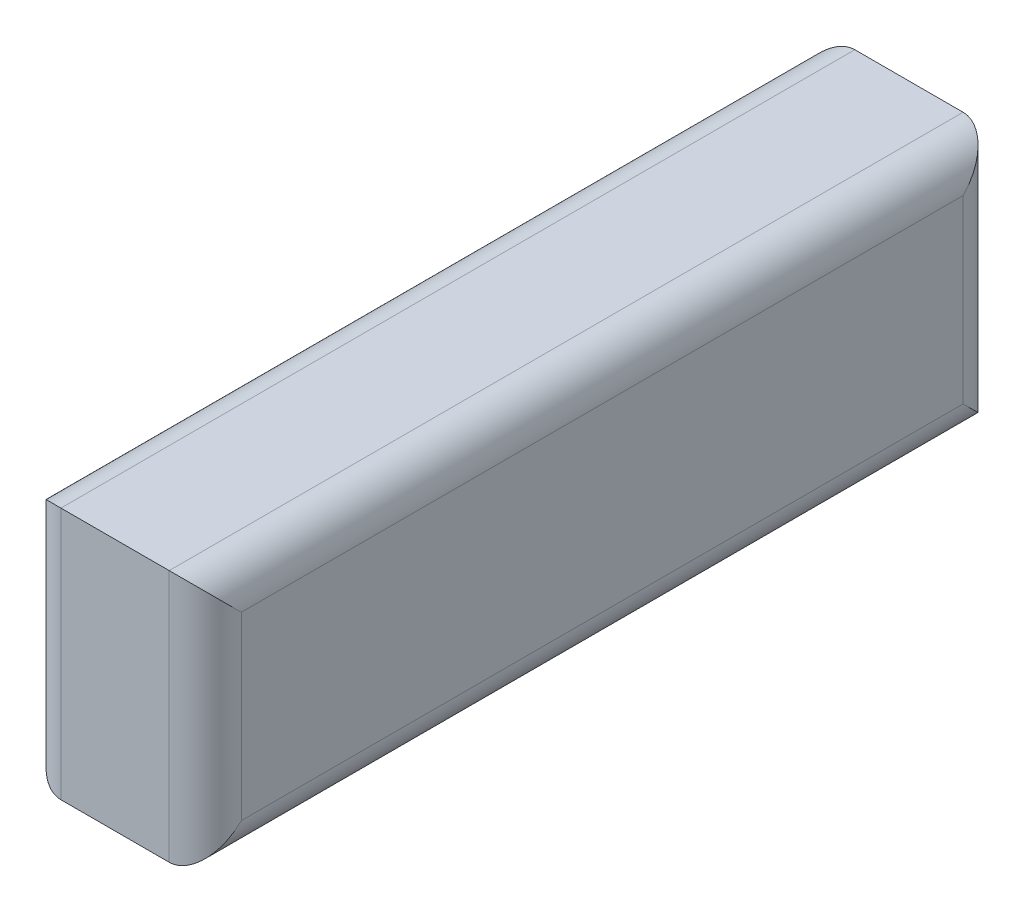
ISO-10303-21;
HEADER;
FILE_DESCRIPTION(('STEP AP214'),'2;1');
FILE_NAME('part.step','',(''),(''),'','','');
FILE_SCHEMA(('AUTOMOTIVE_DESIGN { 1 0 10303 214 1 1 1 1 }'));
ENDSEC;
DATA;
#1=APPLICATION_CONTEXT('core data for automotive mechanical design processes');
#2=APPLICATION_PROTOCOL_DEFINITION('international standard','automotive_design',2000,#1);
#3=PRODUCT_CONTEXT('',#1,'mechanical');
#4=PRODUCT('Part','Part','',(#3));
#5=PRODUCT_RELATED_PRODUCT_CATEGORY('part','',(#4));
#6=PRODUCT_DEFINITION_FORMATION('','',#4);
#7=PRODUCT_DEFINITION_CONTEXT('part definition',#1,'design');
#8=PRODUCT_DEFINITION('design','',#6,#7);
#9=PRODUCT_DEFINITION_SHAPE('','',#8);
#10=(LENGTH_UNIT() NAMED_UNIT(*) SI_UNIT(.MILLI.,.METRE.));
#11=(NAMED_UNIT(*) PLANE_ANGLE_UNIT() SI_UNIT($,.RADIAN.));
#12=(NAMED_UNIT(*) SI_UNIT($,.STERADIAN.) SOLID_ANGLE_UNIT());
#13=UNCERTAINTY_MEASURE_WITH_UNIT(LENGTH_MEASURE(1.E-05),#10,'distance_accuracy_value','');
#14=(GEOMETRIC_REPRESENTATION_CONTEXT(3) GLOBAL_UNCERTAINTY_ASSIGNED_CONTEXT((#13)) GLOBAL_UNIT_ASSIGNED_CONTEXT((#10,
#11,#12)) REPRESENTATION_CONTEXT('',''));
#15=CARTESIAN_POINT('',(0.,0.,0.));
#16=DIRECTION('',(0.,0.,1.));
#17=DIRECTION('',(1.,0.,0.));
#18=AXIS2_PLACEMENT_3D('',#15,#16,#17);
#19=CARTESIAN_POINT('',(-12.5,-17.5,110.));
#20=DIRECTION('',(1.,0.,0.));
#21=DIRECTION('',(0.,0.,-1.));
#22=AXIS2_PLACEMENT_3D('',#19,#20,#21);
#23=PLANE('',#22);
#24=DIRECTION('',(0.,-1.,0.));
#25=VECTOR('',#24,1.);
#26=CARTESIAN_POINT('',(-12.5,17.5,105.));
#27=LINE('',#26,#25);
#28=CARTESIAN_POINT('',(-12.5,-12.5,105.));
#29=VERTEX_POINT('',#28);
#30=CARTESIAN_POINT('',(-12.5,12.5,105.));
#31=VERTEX_POINT('',#30);
#32=EDGE_CURVE('E130',#29,#31,#27,.F.);
#33=ORIENTED_EDGE('',*,*,#32,.T.);
#34=DIRECTION('',(0.,0.,-1.));
#35=VECTOR('',#34,1.);
#36=CARTESIAN_POINT('',(-12.5,12.5,110.));
#37=LINE('',#36,#35);
#38=CARTESIAN_POINT('',(-12.5,12.5,5.));
#39=VERTEX_POINT('',#38);
#40=EDGE_CURVE('E110',#31,#39,#37,.T.);
#41=ORIENTED_EDGE('',*,*,#40,.T.);
#42=DIRECTION('',(0.,-1.,0.));
#43=VECTOR('',#42,1.);
#44=CARTESIAN_POINT('',(-12.5,-17.5,5.));
#45=LINE('',#44,#43);
#46=CARTESIAN_POINT('',(-12.5,-12.5,5.));
#47=VERTEX_POINT('',#46);
#48=EDGE_CURVE('E119',#39,#47,#45,.T.);
#49=ORIENTED_EDGE('',*,*,#48,.T.);
#50=DIRECTION('',(0.,0.,-1.));
#51=VECTOR('',#50,1.);
#52=CARTESIAN_POINT('',(-12.5,-12.5,110.));
#53=LINE('',#52,#51);
#54=EDGE_CURVE('E126',#47,#29,#53,.F.);
#55=ORIENTED_EDGE('',*,*,#54,.T.);
#56=EDGE_LOOP('',(#33,#41,#49,#55));
#57=FACE_BOUND('',#56,.T.);
#58=ADVANCED_FACE('F39',(#57),#23,.F.);
#59=CARTESIAN_POINT('',(12.5,-17.5,110.));
#60=DIRECTION('',(0.,1.,0.));
#61=DIRECTION('',(-1.,0.,0.));
#62=AXIS2_PLACEMENT_3D('',#59,#60,#61);
#63=PLANE('',#62);
#64=DIRECTION('',(1.,0.,0.));
#65=VECTOR('',#64,1.);
#66=CARTESIAN_POINT('',(12.5,-17.5,110.));
#67=LINE('',#66,#65);
#68=CARTESIAN_POINT('',(-7.5,-17.5,110.));
#69=VERTEX_POINT('',#68);
#70=CARTESIAN_POINT('',(7.5,-17.5,110.));
#71=VERTEX_POINT('',#70);
#72=EDGE_CURVE('E209',#69,#71,#67,.T.);
#73=ORIENTED_EDGE('',*,*,#72,.F.);
#74=DIRECTION('',(0.,0.,-1.));
#75=VECTOR('',#74,1.);
#76=CARTESIAN_POINT('',(-7.5,-17.5,110.));
#77=LINE('',#76,#75);
#78=CARTESIAN_POINT('',(-7.5,-17.5,0.));
#79=VERTEX_POINT('',#78);
#80=EDGE_CURVE('E153',#69,#79,#77,.T.);
#81=ORIENTED_EDGE('',*,*,#80,.T.);
#82=DIRECTION('',(1.,0.,0.));
#83=VECTOR('',#82,1.);
#84=CARTESIAN_POINT('',(12.5,-17.5,0.));
#85=LINE('',#84,#83);
#86=CARTESIAN_POINT('',(7.5,-17.5,0.));
#87=VERTEX_POINT('',#86);
#88=EDGE_CURVE('E177',#79,#87,#85,.T.);
#89=ORIENTED_EDGE('',*,*,#88,.T.);
#90=DIRECTION('',(0.,0.,-1.));
#91=VECTOR('',#90,1.);
#92=CARTESIAN_POINT('',(7.5,-17.5,110.));
#93=LINE('',#92,#91);
#94=EDGE_CURVE('E149',#87,#71,#93,.F.);
#95=ORIENTED_EDGE('',*,*,#94,.T.);
#96=EDGE_LOOP('',(#73,#81,#89,#95));
#97=FACE_BOUND('',#96,.T.);
#98=ADVANCED_FACE('F230',(#97),#63,.F.);
#99=CARTESIAN_POINT('',(12.5,-17.5,110.));
#100=DIRECTION('',(-1.,0.,0.));
#101=DIRECTION('',(0.,0.,1.));
#102=AXIS2_PLACEMENT_3D('',#99,#100,#101);
#103=PLANE('',#102);
#104=DIRECTION('',(0.,1.,0.));
#105=VECTOR('',#104,1.);
#106=CARTESIAN_POINT('',(12.5,-17.5,105.));
#107=LINE('',#106,#105);
#108=CARTESIAN_POINT('',(12.5,12.5,105.));
#109=VERTEX_POINT('',#108);
#110=CARTESIAN_POINT('',(12.5,-12.5,105.));
#111=VERTEX_POINT('',#110);
#112=EDGE_CURVE('E49',#109,#111,#107,.F.);
#113=ORIENTED_EDGE('',*,*,#112,.T.);
#114=DIRECTION('',(0.,0.,-1.));
#115=VECTOR('',#114,1.);
#116=CARTESIAN_POINT('',(12.5,-12.5,110.));
#117=LINE('',#116,#115);
#118=CARTESIAN_POINT('',(12.5,-12.5,5.));
#119=VERTEX_POINT('',#118);
#120=EDGE_CURVE('E11',#111,#119,#117,.T.);
#121=ORIENTED_EDGE('',*,*,#120,.T.);
#122=DIRECTION('',(0.,1.,0.));
#123=VECTOR('',#122,1.);
#124=CARTESIAN_POINT('',(12.5,-17.5,5.));
#125=LINE('',#124,#123);
#126=CARTESIAN_POINT('',(12.5,12.5,5.));
#127=VERTEX_POINT('',#126);
#128=EDGE_CURVE('E162',#119,#127,#125,.T.);
#129=ORIENTED_EDGE('',*,*,#128,.T.);
#130=DIRECTION('',(0.,0.,-1.));
#131=VECTOR('',#130,1.);
#132=CARTESIAN_POINT('',(12.5,12.5,110.));
#133=LINE('',#132,#131);
#134=EDGE_CURVE('E60',#127,#109,#133,.F.);
#135=ORIENTED_EDGE('',*,*,#134,.T.);
#136=EDGE_LOOP('',(#113,#121,#129,#135));
#137=FACE_BOUND('',#136,.T.);
#138=ADVANCED_FACE('F237',(#137),#103,.F.);
#139=CARTESIAN_POINT('',(12.5,17.5,110.));
#140=DIRECTION('',(0.,-1.,0.));
#141=DIRECTION('',(1.,0.,0.));
#142=AXIS2_PLACEMENT_3D('',#139,#140,#141);
#143=PLANE('',#142);
#144=DIRECTION('',(-1.,0.,0.));
#145=VECTOR('',#144,1.);
#146=CARTESIAN_POINT('',(12.5,17.5,0.));
#147=LINE('',#146,#145);
#148=CARTESIAN_POINT('',(7.5,17.5,0.));
#149=VERTEX_POINT('',#148);
#150=CARTESIAN_POINT('',(-7.5,17.5,0.));
#151=VERTEX_POINT('',#150);
#152=EDGE_CURVE('E202',#149,#151,#147,.T.);
#153=ORIENTED_EDGE('',*,*,#152,.T.);
#154=DIRECTION('',(0.,0.,-1.));
#155=VECTOR('',#154,1.);
#156=CARTESIAN_POINT('',(-7.5,17.5,110.));
#157=LINE('',#156,#155);
#158=CARTESIAN_POINT('',(-7.5,17.5,110.));
#159=VERTEX_POINT('',#158);
#160=EDGE_CURVE('E112',#151,#159,#157,.F.);
#161=ORIENTED_EDGE('',*,*,#160,.T.);
#162=DIRECTION('',(-1.,0.,0.));
#163=VECTOR('',#162,1.);
#164=CARTESIAN_POINT('',(12.5,17.5,110.));
#165=LINE('',#164,#163);
#166=CARTESIAN_POINT('',(7.5,17.5,110.));
#167=VERTEX_POINT('',#166);
#168=EDGE_CURVE('E127',#167,#159,#165,.T.);
#169=ORIENTED_EDGE('',*,*,#168,.F.);
#170=DIRECTION('',(0.,0.,-1.));
#171=VECTOR('',#170,1.);
#172=CARTESIAN_POINT('',(7.5,17.5,110.));
#173=LINE('',#172,#171);
#174=EDGE_CURVE('E133',#167,#149,#173,.T.);
#175=ORIENTED_EDGE('',*,*,#174,.T.);
#176=EDGE_LOOP('',(#153,#161,#169,#175));
#177=FACE_BOUND('',#176,.T.);
#178=ADVANCED_FACE('F201',(#177),#143,.F.);
#179=CARTESIAN_POINT('',(0.,0.,110.));
#180=DIRECTION('',(0.,0.,1.));
#181=DIRECTION('',(1.,0.,0.));
#182=AXIS2_PLACEMENT_3D('',#179,#180,#181);
#183=PLANE('',#182);
#184=ORIENTED_EDGE('',*,*,#168,.T.);
#185=DIRECTION('',(0.,-1.,0.));
#186=VECTOR('',#185,1.);
#187=CARTESIAN_POINT('',(-7.5,-17.5,110.));
#188=LINE('',#187,#186);
#189=EDGE_CURVE('E146',#159,#69,#188,.T.);
#190=ORIENTED_EDGE('',*,*,#189,.T.);
#191=ORIENTED_EDGE('',*,*,#72,.T.);
#192=DIRECTION('',(0.,1.,0.));
#193=VECTOR('',#192,1.);
#194=CARTESIAN_POINT('',(7.5,17.5,110.));
#195=LINE('',#194,#193);
#196=EDGE_CURVE('E143',#71,#167,#195,.T.);
#197=ORIENTED_EDGE('',*,*,#196,.T.);
#198=EDGE_LOOP('',(#184,#190,#191,#197));
#199=FACE_BOUND('',#198,.T.);
#200=ADVANCED_FACE('F227',(#199),#183,.T.);
#201=CARTESIAN_POINT('',(0.,0.,0.));
#202=DIRECTION('',(0.,0.,1.));
#203=DIRECTION('',(1.,0.,0.));
#204=AXIS2_PLACEMENT_3D('',#201,#202,#203);
#205=PLANE('',#204);
#206=ORIENTED_EDGE('',*,*,#88,.F.);
#207=DIRECTION('',(0.,-1.,0.));
#208=VECTOR('',#207,1.);
#209=CARTESIAN_POINT('',(-7.5,0.,0.));
#210=LINE('',#209,#208);
#211=EDGE_CURVE('E159',#79,#151,#210,.F.);
#212=ORIENTED_EDGE('',*,*,#211,.T.);
#213=ORIENTED_EDGE('',*,*,#152,.F.);
#214=DIRECTION('',(0.,1.,0.));
#215=VECTOR('',#214,1.);
#216=CARTESIAN_POINT('',(7.5,0.,0.));
#217=LINE('',#216,#215);
#218=EDGE_CURVE('E156',#149,#87,#217,.F.);
#219=ORIENTED_EDGE('',*,*,#218,.T.);
#220=EDGE_LOOP('',(#206,#212,#213,#219));
#221=FACE_BOUND('',#220,.T.);
#222=ADVANCED_FACE('F206',(#221),#205,.F.);
#223=CARTESIAN_POINT('',(-7.5,-12.5,110.));
#224=DIRECTION('',(0.,0.,-1.));
#225=DIRECTION('',(-1.,0.,0.));
#226=AXIS2_PLACEMENT_3D('',#223,#224,#225);
#227=CYLINDRICAL_SURFACE('',#226,5.);
#228=CARTESIAN_POINT('',(-7.5,-12.5,5.));
#229=DIRECTION('',(0.,-0.707106781186547,0.707106781186547));
#230=DIRECTION('',(0.,-0.707106781186547,-0.707106781186547));
#231=AXIS2_PLACEMENT_3D('',#228,#229,#230);
#232=ELLIPSE('',#231,7.07106781186547,5.);
#233=EDGE_CURVE('E122',#79,#47,#232,.F.);
#234=ORIENTED_EDGE('',*,*,#233,.F.);
#235=ORIENTED_EDGE('',*,*,#80,.F.);
#236=CARTESIAN_POINT('',(-7.5,-12.5,105.));
#237=DIRECTION('',(0.,-0.707106781186547,-0.707106781186547));
#238=DIRECTION('',(0.,0.707106781186547,-0.707106781186547));
#239=AXIS2_PLACEMENT_3D('',#236,#237,#238);
#240=ELLIPSE('',#239,7.07106781186547,5.);
#241=EDGE_CURVE('E173',#29,#69,#240,.F.);
#242=ORIENTED_EDGE('',*,*,#241,.F.);
#243=ORIENTED_EDGE('',*,*,#54,.F.);
#244=EDGE_LOOP('',(#234,#235,#242,#243));
#245=FACE_BOUND('',#244,.T.);
#246=ADVANCED_FACE('F221',(#245),#227,.T.);
#247=CARTESIAN_POINT('',(-7.5,0.,105.));
#248=DIRECTION('',(0.,1.,0.));
#249=DIRECTION('',(0.,0.,1.));
#250=AXIS2_PLACEMENT_3D('',#247,#248,#249);
#251=CYLINDRICAL_SURFACE('',#250,5.);
#252=ORIENTED_EDGE('',*,*,#241,.T.);
#253=ORIENTED_EDGE('',*,*,#189,.F.);
#254=CARTESIAN_POINT('',(-7.5,12.5,105.));
#255=DIRECTION('',(0.,0.707106781186547,-0.707106781186547));
#256=DIRECTION('',(0.,0.707106781186547,0.707106781186547));
#257=AXIS2_PLACEMENT_3D('',#254,#255,#256);
#258=ELLIPSE('',#257,7.07106781186547,5.);
#259=EDGE_CURVE('E116',#31,#159,#258,.T.);
#260=ORIENTED_EDGE('',*,*,#259,.F.);
#261=ORIENTED_EDGE('',*,*,#32,.F.);
#262=EDGE_LOOP('',(#252,#253,#260,#261));
#263=FACE_BOUND('',#262,.T.);
#264=ADVANCED_FACE('F224',(#263),#251,.T.);
#265=CARTESIAN_POINT('',(-7.5,-17.5,5.));
#266=DIRECTION('',(0.,-1.,0.));
#267=DIRECTION('',(0.,0.,-1.));
#268=AXIS2_PLACEMENT_3D('',#265,#266,#267);
#269=CYLINDRICAL_SURFACE('',#268,5.);
#270=ORIENTED_EDGE('',*,*,#233,.T.);
#271=ORIENTED_EDGE('',*,*,#48,.F.);
#272=CARTESIAN_POINT('',(-7.5,12.5,5.));
#273=DIRECTION('',(0.,-0.707106781186547,-0.707106781186547));
#274=DIRECTION('',(0.,-0.707106781186547,0.707106781186547));
#275=AXIS2_PLACEMENT_3D('',#272,#273,#274);
#276=ELLIPSE('',#275,7.07106781186547,5.);
#277=EDGE_CURVE('E106',#151,#39,#276,.F.);
#278=ORIENTED_EDGE('',*,*,#277,.F.);
#279=ORIENTED_EDGE('',*,*,#211,.F.);
#280=EDGE_LOOP('',(#270,#271,#278,#279));
#281=FACE_BOUND('',#280,.T.);
#282=ADVANCED_FACE('F120',(#281),#269,.T.);
#283=CARTESIAN_POINT('',(-7.5,12.5,110.));
#284=DIRECTION('',(0.,0.,-1.));
#285=DIRECTION('',(-1.,0.,0.));
#286=AXIS2_PLACEMENT_3D('',#283,#284,#285);
#287=CYLINDRICAL_SURFACE('',#286,5.);
#288=ORIENTED_EDGE('',*,*,#259,.T.);
#289=ORIENTED_EDGE('',*,*,#160,.F.);
#290=ORIENTED_EDGE('',*,*,#277,.T.);
#291=ORIENTED_EDGE('',*,*,#40,.F.);
#292=EDGE_LOOP('',(#288,#289,#290,#291));
#293=FACE_BOUND('',#292,.T.);
#294=ADVANCED_FACE('F108',(#293),#287,.T.);
#295=CARTESIAN_POINT('',(7.5,12.5,110.));
#296=DIRECTION('',(0.,0.,-1.));
#297=DIRECTION('',(-1.,0.,0.));
#298=AXIS2_PLACEMENT_3D('',#295,#296,#297);
#299=CYLINDRICAL_SURFACE('',#298,5.);
#300=CARTESIAN_POINT('',(7.5,12.5,5.));
#301=DIRECTION('',(0.,0.707106781186547,0.707106781186547));
#302=DIRECTION('',(0.,0.707106781186547,-0.707106781186547));
#303=AXIS2_PLACEMENT_3D('',#300,#301,#302);
#304=ELLIPSE('',#303,7.07106781186547,5.);
#305=EDGE_CURVE('E183',#149,#127,#304,.F.);
#306=ORIENTED_EDGE('',*,*,#305,.F.);
#307=ORIENTED_EDGE('',*,*,#174,.F.);
#308=CARTESIAN_POINT('',(7.5,12.5,105.));
#309=DIRECTION('',(0.,0.707106781186547,-0.707106781186547));
#310=DIRECTION('',(0.,-0.707106781186547,-0.707106781186547));
#311=AXIS2_PLACEMENT_3D('',#308,#309,#310);
#312=ELLIPSE('',#311,7.07106781186547,5.);
#313=EDGE_CURVE('E43',#109,#167,#312,.F.);
#314=ORIENTED_EDGE('',*,*,#313,.F.);
#315=ORIENTED_EDGE('',*,*,#134,.F.);
#316=EDGE_LOOP('',(#306,#307,#314,#315));
#317=FACE_BOUND('',#316,.T.);
#318=ADVANCED_FACE('F41',(#317),#299,.T.);
#319=CARTESIAN_POINT('',(7.5,0.,105.));
#320=DIRECTION('',(0.,-1.,0.));
#321=DIRECTION('',(0.,0.,-1.));
#322=AXIS2_PLACEMENT_3D('',#319,#320,#321);
#323=CYLINDRICAL_SURFACE('',#322,5.);
#324=ORIENTED_EDGE('',*,*,#313,.T.);
#325=ORIENTED_EDGE('',*,*,#196,.F.);
#326=CARTESIAN_POINT('',(7.5,-12.5,105.));
#327=DIRECTION('',(0.,-0.707106781186547,-0.707106781186547));
#328=DIRECTION('',(0.,-0.707106781186547,0.707106781186547));
#329=AXIS2_PLACEMENT_3D('',#326,#327,#328);
#330=ELLIPSE('',#329,7.07106781186547,5.);
#331=EDGE_CURVE('E181',#111,#71,#330,.T.);
#332=ORIENTED_EDGE('',*,*,#331,.F.);
#333=ORIENTED_EDGE('',*,*,#112,.F.);
#334=EDGE_LOOP('',(#324,#325,#332,#333));
#335=FACE_BOUND('',#334,.T.);
#336=ADVANCED_FACE('F194',(#335),#323,.T.);
#337=CARTESIAN_POINT('',(7.5,-17.5,5.));
#338=DIRECTION('',(0.,1.,0.));
#339=DIRECTION('',(0.,0.,1.));
#340=AXIS2_PLACEMENT_3D('',#337,#338,#339);
#341=CYLINDRICAL_SURFACE('',#340,5.);
#342=ORIENTED_EDGE('',*,*,#305,.T.);
#343=ORIENTED_EDGE('',*,*,#128,.F.);
#344=CARTESIAN_POINT('',(7.5,-12.5,5.));
#345=DIRECTION('',(0.,0.707106781186547,-0.707106781186547));
#346=DIRECTION('',(0.,0.707106781186547,0.707106781186547));
#347=AXIS2_PLACEMENT_3D('',#344,#345,#346);
#348=ELLIPSE('',#347,7.07106781186547,5.);
#349=EDGE_CURVE('E178',#87,#119,#348,.F.);
#350=ORIENTED_EDGE('',*,*,#349,.F.);
#351=ORIENTED_EDGE('',*,*,#218,.F.);
#352=EDGE_LOOP('',(#342,#343,#350,#351));
#353=FACE_BOUND('',#352,.T.);
#354=ADVANCED_FACE('F236',(#353),#341,.T.);
#355=CARTESIAN_POINT('',(7.5,-12.5,110.));
#356=DIRECTION('',(0.,0.,-1.));
#357=DIRECTION('',(-1.,0.,0.));
#358=AXIS2_PLACEMENT_3D('',#355,#356,#357);
#359=CYLINDRICAL_SURFACE('',#358,5.);
#360=ORIENTED_EDGE('',*,*,#331,.T.);
#361=ORIENTED_EDGE('',*,*,#94,.F.);
#362=ORIENTED_EDGE('',*,*,#349,.T.);
#363=ORIENTED_EDGE('',*,*,#120,.F.);
#364=EDGE_LOOP('',(#360,#361,#362,#363));
#365=FACE_BOUND('',#364,.T.);
#366=ADVANCED_FACE('F234',(#365),#359,.T.);
#367=CLOSED_SHELL('',(#58,#98,#138,#178,#200,#222,#246,#264,#282,#294,#318,#336,#354,#366));
#368=MANIFOLD_SOLID_BREP('B2',#367);
#369=ADVANCED_BREP_SHAPE_REPRESENTATION('',(#18,#368),#14);
#370=SHAPE_DEFINITION_REPRESENTATION(#9,#369);
ENDSEC;
END-ISO-10303-21;
